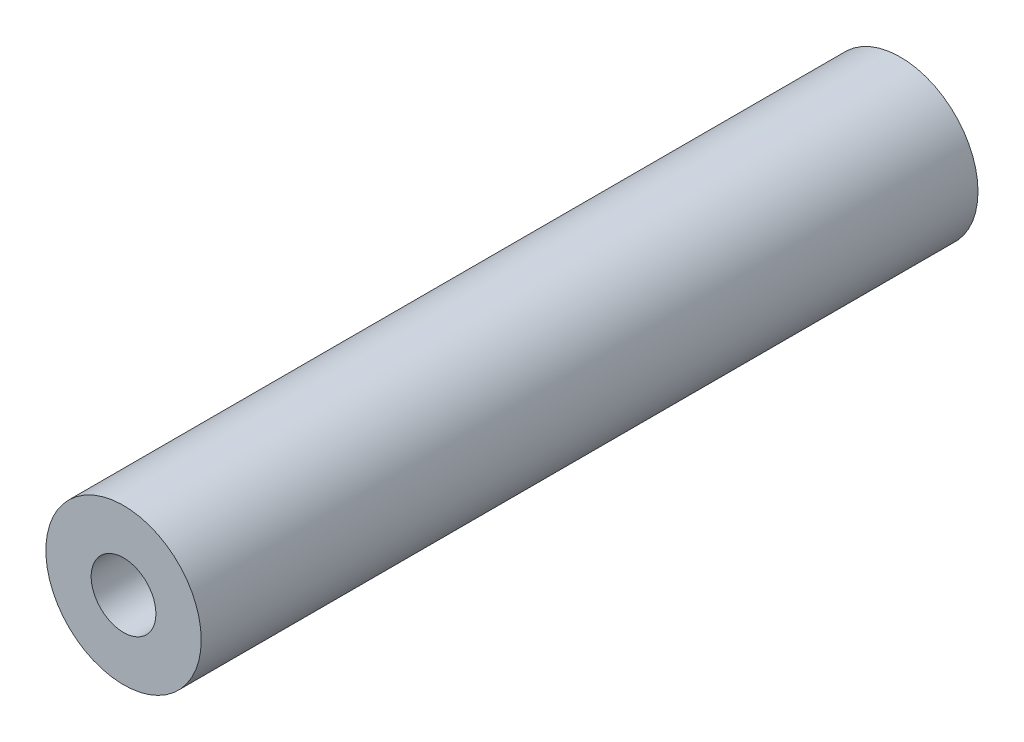
ISO-10303-21;
HEADER;
FILE_DESCRIPTION(('STEP AP214'),'2;1');
FILE_NAME('part.step','',(''),(''),'','','');
FILE_SCHEMA(('AUTOMOTIVE_DESIGN { 1 0 10303 214 1 1 1 1 }'));
ENDSEC;
DATA;
#1=APPLICATION_CONTEXT('core data for automotive mechanical design processes');
#2=APPLICATION_PROTOCOL_DEFINITION('international standard','automotive_design',2000,#1);
#3=PRODUCT_CONTEXT('',#1,'mechanical');
#4=PRODUCT('Part','Part','',(#3));
#5=PRODUCT_RELATED_PRODUCT_CATEGORY('part','',(#4));
#6=PRODUCT_DEFINITION_FORMATION('','',#4);
#7=PRODUCT_DEFINITION_CONTEXT('part definition',#1,'design');
#8=PRODUCT_DEFINITION('design','',#6,#7);
#9=PRODUCT_DEFINITION_SHAPE('','',#8);
#10=(LENGTH_UNIT() NAMED_UNIT(*) SI_UNIT(.MILLI.,.METRE.));
#11=(NAMED_UNIT(*) PLANE_ANGLE_UNIT() SI_UNIT($,.RADIAN.));
#12=(NAMED_UNIT(*) SI_UNIT($,.STERADIAN.) SOLID_ANGLE_UNIT());
#13=UNCERTAINTY_MEASURE_WITH_UNIT(LENGTH_MEASURE(1.E-05),#10,'distance_accuracy_value','');
#14=(GEOMETRIC_REPRESENTATION_CONTEXT(3) GLOBAL_UNCERTAINTY_ASSIGNED_CONTEXT((#13)) GLOBAL_UNIT_ASSIGNED_CONTEXT((#10,
#11,#12)) REPRESENTATION_CONTEXT('',''));
#15=CARTESIAN_POINT('',(0.,0.,0.));
#16=DIRECTION('',(0.,0.,1.));
#17=DIRECTION('',(1.,0.,0.));
#18=AXIS2_PLACEMENT_3D('',#15,#16,#17);
#19=CARTESIAN_POINT('',(0.,0.,-30.));
#20=DIRECTION('',(0.,0.,1.));
#21=DIRECTION('',(1.,0.,0.));
#22=AXIS2_PLACEMENT_3D('',#19,#20,#21);
#23=CYLINDRICAL_SURFACE('',#22,6.);
#24=CARTESIAN_POINT('',(0.,0.,0.));
#25=DIRECTION('',(0.,0.,1.));
#26=DIRECTION('',(1.,0.,0.));
#27=AXIS2_PLACEMENT_3D('',#24,#25,#26);
#28=CIRCLE('',#27,6.);
#29=CARTESIAN_POINT('',(6.,0.,0.));
#30=VERTEX_POINT('',#29);
#31=EDGE_CURVE('E11',#30,#30,#28,.T.);
#32=ORIENTED_EDGE('',*,*,#31,.F.);
#33=EDGE_LOOP('',(#32));
#34=FACE_BOUND('',#33,.T.);
#35=CARTESIAN_POINT('',(0.,0.,-60.));
#36=DIRECTION('',(0.,0.,1.));
#37=DIRECTION('',(1.,0.,0.));
#38=AXIS2_PLACEMENT_3D('',#35,#36,#37);
#39=CIRCLE('',#38,6.);
#40=CARTESIAN_POINT('',(6.,0.,-60.));
#41=VERTEX_POINT('',#40);
#42=EDGE_CURVE('E64',#41,#41,#39,.T.);
#43=ORIENTED_EDGE('',*,*,#42,.T.);
#44=EDGE_LOOP('',(#43));
#45=FACE_BOUND('',#44,.T.);
#46=ADVANCED_FACE('F39',(#34,#45),#23,.T.);
#47=CARTESIAN_POINT('',(0.,0.,0.));
#48=DIRECTION('',(0.,0.,1.));
#49=DIRECTION('',(1.,0.,0.));
#50=AXIS2_PLACEMENT_3D('',#47,#48,#49);
#51=PLANE('',#50);
#52=CARTESIAN_POINT('',(0.,0.,0.));
#53=DIRECTION('',(0.,0.,1.));
#54=DIRECTION('',(1.,0.,0.));
#55=AXIS2_PLACEMENT_3D('',#52,#53,#54);
#56=CIRCLE('',#55,2.49999999999999);
#57=CARTESIAN_POINT('',(2.49999999999999,0.,0.));
#58=VERTEX_POINT('',#57);
#59=EDGE_CURVE('E70',#58,#58,#56,.T.);
#60=ORIENTED_EDGE('',*,*,#59,.F.);
#61=EDGE_LOOP('',(#60));
#62=FACE_BOUND('',#61,.T.);
#63=ORIENTED_EDGE('',*,*,#31,.T.);
#64=EDGE_LOOP('',(#63));
#65=FACE_BOUND('',#64,.T.);
#66=ADVANCED_FACE('F89',(#62,#65),#51,.T.);
#67=CARTESIAN_POINT('',(0.,0.,-22.));
#68=DIRECTION('',(0.,0.,1.));
#69=DIRECTION('',(1.,0.,0.));
#70=AXIS2_PLACEMENT_3D('',#67,#68,#69);
#71=CONICAL_SURFACE('',#70,2.5,1.02974425867665);
#72=CARTESIAN_POINT('',(0.,0.,-23.5021515475689));
#73=VERTEX_POINT('',#72);
#74=VERTEX_LOOP('',#73);
#75=FACE_BOUND('',#74,.T.);
#76=CARTESIAN_POINT('',(0.,0.,-22.));
#77=DIRECTION('',(0.,0.,1.));
#78=DIRECTION('',(1.,0.,0.));
#79=AXIS2_PLACEMENT_3D('',#76,#77,#78);
#80=CIRCLE('',#79,2.5);
#81=CARTESIAN_POINT('',(2.5,0.,-22.));
#82=VERTEX_POINT('',#81);
#83=EDGE_CURVE('E47',#82,#82,#80,.T.);
#84=ORIENTED_EDGE('',*,*,#83,.T.);
#85=EDGE_LOOP('',(#84));
#86=FACE_BOUND('',#85,.T.);
#87=ADVANCED_FACE('F81',(#75,#86),#71,.F.);
#88=CARTESIAN_POINT('',(0.,0.,0.));
#89=DIRECTION('',(0.,0.,1.));
#90=DIRECTION('',(1.,0.,0.));
#91=AXIS2_PLACEMENT_3D('',#88,#89,#90);
#92=CYLINDRICAL_SURFACE('',#91,2.49999999999999);
#93=ORIENTED_EDGE('',*,*,#83,.F.);
#94=EDGE_LOOP('',(#93));
#95=FACE_BOUND('',#94,.T.);
#96=ORIENTED_EDGE('',*,*,#59,.T.);
#97=EDGE_LOOP('',(#96));
#98=FACE_BOUND('',#97,.T.);
#99=ADVANCED_FACE('F83',(#95,#98),#92,.F.);
#100=CARTESIAN_POINT('',(0.,0.,-60.));
#101=DIRECTION('',(0.,0.,-1.));
#102=DIRECTION('',(1.,0.,0.));
#103=AXIS2_PLACEMENT_3D('',#100,#101,#102);
#104=PLANE('',#103);
#105=CARTESIAN_POINT('',(0.,0.,-60.));
#106=DIRECTION('',(0.,0.,-1.));
#107=DIRECTION('',(-1.,0.,0.));
#108=AXIS2_PLACEMENT_3D('',#105,#106,#107);
#109=CIRCLE('',#108,2.49999999999999);
#110=CARTESIAN_POINT('',(-2.49999999999999,0.,-60.));
#111=VERTEX_POINT('',#110);
#112=EDGE_CURVE('E65',#111,#111,#109,.T.);
#113=ORIENTED_EDGE('',*,*,#112,.F.);
#114=EDGE_LOOP('',(#113));
#115=FACE_BOUND('',#114,.T.);
#116=ORIENTED_EDGE('',*,*,#42,.F.);
#117=EDGE_LOOP('',(#116));
#118=FACE_BOUND('',#117,.T.);
#119=ADVANCED_FACE('F57',(#115,#118),#104,.T.);
#120=CARTESIAN_POINT('',(0.,0.,-38.));
#121=DIRECTION('',(0.,0.,-1.));
#122=DIRECTION('',(-1.,0.,0.));
#123=AXIS2_PLACEMENT_3D('',#120,#121,#122);
#124=CONICAL_SURFACE('',#123,2.5,1.02974425867665);
#125=CARTESIAN_POINT('',(0.,0.,-36.4978484524311));
#126=VERTEX_POINT('',#125);
#127=VERTEX_LOOP('',#126);
#128=FACE_BOUND('',#127,.T.);
#129=CARTESIAN_POINT('',(0.,0.,-38.));
#130=DIRECTION('',(0.,0.,-1.));
#131=DIRECTION('',(-1.,0.,0.));
#132=AXIS2_PLACEMENT_3D('',#129,#130,#131);
#133=CIRCLE('',#132,2.5);
#134=CARTESIAN_POINT('',(-2.5,0.,-38.));
#135=VERTEX_POINT('',#134);
#136=EDGE_CURVE('E61',#135,#135,#133,.T.);
#137=ORIENTED_EDGE('',*,*,#136,.T.);
#138=EDGE_LOOP('',(#137));
#139=FACE_BOUND('',#138,.T.);
#140=ADVANCED_FACE('F53',(#128,#139),#124,.F.);
#141=CARTESIAN_POINT('',(0.,0.,-60.));
#142=DIRECTION('',(0.,0.,-1.));
#143=DIRECTION('',(-1.,0.,0.));
#144=AXIS2_PLACEMENT_3D('',#141,#142,#143);
#145=CYLINDRICAL_SURFACE('',#144,2.49999999999999);
#146=ORIENTED_EDGE('',*,*,#136,.F.);
#147=EDGE_LOOP('',(#146));
#148=FACE_BOUND('',#147,.T.);
#149=ORIENTED_EDGE('',*,*,#112,.T.);
#150=EDGE_LOOP('',(#149));
#151=FACE_BOUND('',#150,.T.);
#152=ADVANCED_FACE('F56',(#148,#151),#145,.F.);
#153=CLOSED_SHELL('',(#46,#66,#87,#99,#119,#140,#152));
#154=MANIFOLD_SOLID_BREP('B2',#153);
#155=ADVANCED_BREP_SHAPE_REPRESENTATION('',(#18,#154),#14);
#156=SHAPE_DEFINITION_REPRESENTATION(#9,#155);
ENDSEC;
END-ISO-10303-21;
